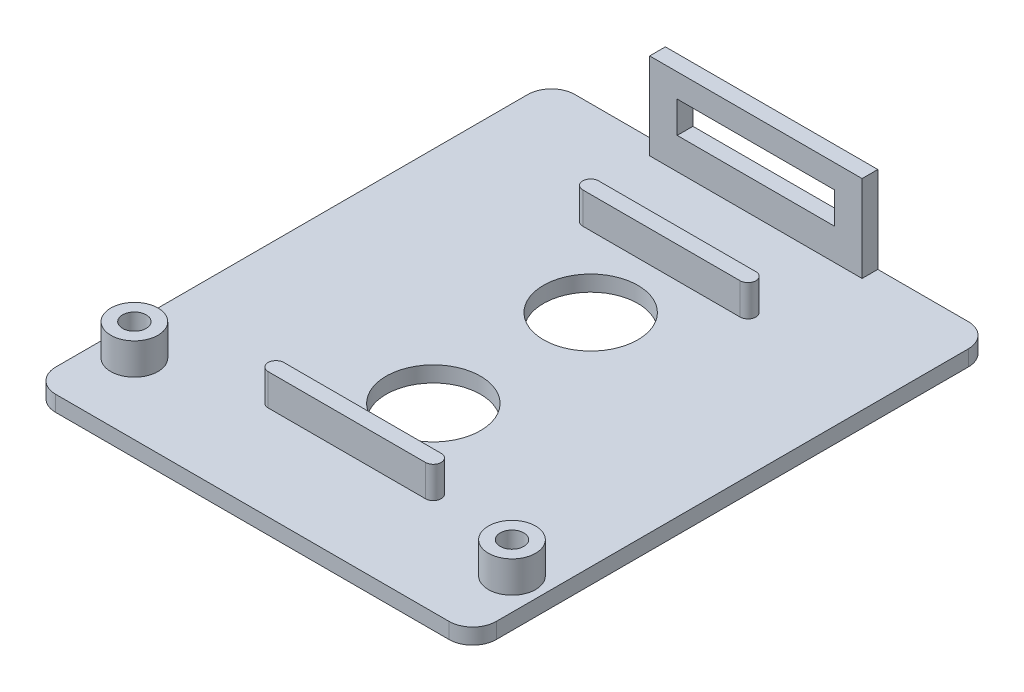
ISO-10303-21;
HEADER;
FILE_DESCRIPTION(('STEP AP214'),'2;1');
FILE_NAME('part.step','',(''),(''),'','','');
FILE_SCHEMA(('AUTOMOTIVE_DESIGN { 1 0 10303 214 1 1 1 1 }'));
ENDSEC;
DATA;
#1=APPLICATION_CONTEXT('core data for automotive mechanical design processes');
#2=APPLICATION_PROTOCOL_DEFINITION('international standard','automotive_design',2000,#1);
#3=PRODUCT_CONTEXT('',#1,'mechanical');
#4=PRODUCT('Part','Part','',(#3));
#5=PRODUCT_RELATED_PRODUCT_CATEGORY('part','',(#4));
#6=PRODUCT_DEFINITION_FORMATION('','',#4);
#7=PRODUCT_DEFINITION_CONTEXT('part definition',#1,'design');
#8=PRODUCT_DEFINITION('design','',#6,#7);
#9=PRODUCT_DEFINITION_SHAPE('','',#8);
#10=(LENGTH_UNIT() NAMED_UNIT(*) SI_UNIT(.MILLI.,.METRE.));
#11=(NAMED_UNIT(*) PLANE_ANGLE_UNIT() SI_UNIT($,.RADIAN.));
#12=(NAMED_UNIT(*) SI_UNIT($,.STERADIAN.) SOLID_ANGLE_UNIT());
#13=UNCERTAINTY_MEASURE_WITH_UNIT(LENGTH_MEASURE(1.E-05),#10,'distance_accuracy_value','');
#14=(GEOMETRIC_REPRESENTATION_CONTEXT(3) GLOBAL_UNCERTAINTY_ASSIGNED_CONTEXT((#13)) GLOBAL_UNIT_ASSIGNED_CONTEXT((#10,
#11,#12)) REPRESENTATION_CONTEXT('',''));
#15=CARTESIAN_POINT('',(0.,0.,0.));
#16=DIRECTION('',(0.,0.,1.));
#17=DIRECTION('',(1.,0.,0.));
#18=AXIS2_PLACEMENT_3D('',#15,#16,#17);
#19=CARTESIAN_POINT('',(0.,1.,0.));
#20=DIRECTION('',(0.,1.,0.));
#21=DIRECTION('',(0.,0.,1.));
#22=AXIS2_PLACEMENT_3D('',#19,#20,#21);
#23=PLANE('',#22);
#24=DIRECTION('',(-1.,0.,0.));
#25=VECTOR('',#24,1.);
#26=CARTESIAN_POINT('',(0.,1.,-9.5));
#27=LINE('',#26,#25);
#28=CARTESIAN_POINT('',(5.,1.,-9.5));
#29=VERTEX_POINT('',#28);
#30=CARTESIAN_POINT('',(-5.,1.,-9.5));
#31=VERTEX_POINT('',#30);
#32=EDGE_CURVE('E139',#29,#31,#27,.T.);
#33=ORIENTED_EDGE('',*,*,#32,.T.);
#34=CARTESIAN_POINT('',(-5.,1.,-10.));
#35=DIRECTION('',(0.,1.,0.));
#36=DIRECTION('',(0.,0.,1.));
#37=AXIS2_PLACEMENT_3D('',#34,#35,#36);
#38=CIRCLE('',#37,0.5);
#39=CARTESIAN_POINT('',(-5.,1.,-10.5));
#40=VERTEX_POINT('',#39);
#41=EDGE_CURVE('E12',#31,#40,#38,.F.);
#42=ORIENTED_EDGE('',*,*,#41,.T.);
#43=DIRECTION('',(-1.,0.,0.));
#44=VECTOR('',#43,1.);
#45=CARTESIAN_POINT('',(0.,1.,-10.5));
#46=LINE('',#45,#44);
#47=CARTESIAN_POINT('',(5.,1.,-10.5));
#48=VERTEX_POINT('',#47);
#49=EDGE_CURVE('E509',#48,#40,#46,.T.);
#50=ORIENTED_EDGE('',*,*,#49,.F.);
#51=CARTESIAN_POINT('',(5.,1.,-10.));
#52=DIRECTION('',(0.,1.,0.));
#53=DIRECTION('',(0.,0.,1.));
#54=AXIS2_PLACEMENT_3D('',#51,#52,#53);
#55=CIRCLE('',#54,0.5);
#56=EDGE_CURVE('E514',#48,#29,#55,.F.);
#57=ORIENTED_EDGE('',*,*,#56,.T.);
#58=EDGE_LOOP('',(#33,#42,#50,#57));
#59=FACE_BOUND('',#58,.T.);
#60=CARTESIAN_POINT('',(0.,1.,5.));
#61=DIRECTION('',(0.,1.,0.));
#62=DIRECTION('',(0.,0.,1.));
#63=AXIS2_PLACEMENT_3D('',#60,#61,#62);
#64=CIRCLE('',#63,3.);
#65=CARTESIAN_POINT('',(0.,1.,8.));
#66=VERTEX_POINT('',#65);
#67=EDGE_CURVE('E412',#66,#66,#64,.T.);
#68=ORIENTED_EDGE('',*,*,#67,.F.);
#69=EDGE_LOOP('',(#68));
#70=FACE_BOUND('',#69,.T.);
#71=CARTESIAN_POINT('',(0.,1.,-5.));
#72=DIRECTION('',(0.,1.,0.));
#73=DIRECTION('',(0.,0.,1.));
#74=AXIS2_PLACEMENT_3D('',#71,#72,#73);
#75=CIRCLE('',#74,3.);
#76=CARTESIAN_POINT('',(0.,1.,-2.));
#77=VERTEX_POINT('',#76);
#78=EDGE_CURVE('E415',#77,#77,#75,.T.);
#79=ORIENTED_EDGE('',*,*,#78,.F.);
#80=EDGE_LOOP('',(#79));
#81=FACE_BOUND('',#80,.T.);
#82=CARTESIAN_POINT('',(12.,1.,12.));
#83=DIRECTION('',(0.,1.,0.));
#84=DIRECTION('',(0.,0.,1.));
#85=AXIS2_PLACEMENT_3D('',#82,#83,#84);
#86=CIRCLE('',#85,1.5);
#87=CARTESIAN_POINT('',(12.,1.,13.5));
#88=VERTEX_POINT('',#87);
#89=EDGE_CURVE('E419',#88,#88,#86,.T.);
#90=ORIENTED_EDGE('',*,*,#89,.F.);
#91=EDGE_LOOP('',(#90));
#92=FACE_BOUND('',#91,.T.);
#93=CARTESIAN_POINT('',(-12.,1.,12.));
#94=DIRECTION('',(0.,1.,0.));
#95=DIRECTION('',(0.,0.,1.));
#96=AXIS2_PLACEMENT_3D('',#93,#94,#95);
#97=CIRCLE('',#96,1.5);
#98=CARTESIAN_POINT('',(-12.,1.,13.5));
#99=VERTEX_POINT('',#98);
#100=EDGE_CURVE('E422',#99,#99,#97,.T.);
#101=ORIENTED_EDGE('',*,*,#100,.F.);
#102=EDGE_LOOP('',(#101));
#103=FACE_BOUND('',#102,.T.);
#104=CARTESIAN_POINT('',(12.5,1.,15.));
#105=DIRECTION('',(0.,1.,0.));
#106=DIRECTION('',(0.,0.,1.));
#107=AXIS2_PLACEMENT_3D('',#104,#105,#106);
#108=CIRCLE('',#107,1.5);
#109=CARTESIAN_POINT('',(14.,1.,15.));
#110=VERTEX_POINT('',#109);
#111=CARTESIAN_POINT('',(12.5,1.,16.5));
#112=VERTEX_POINT('',#111);
#113=EDGE_CURVE('E425',#110,#112,#108,.F.);
#114=ORIENTED_EDGE('',*,*,#113,.F.);
#115=DIRECTION('',(0.,0.,1.));
#116=VECTOR('',#115,1.);
#117=CARTESIAN_POINT('',(14.,1.,0.));
#118=LINE('',#117,#116);
#119=CARTESIAN_POINT('',(14.,1.,-15.));
#120=VERTEX_POINT('',#119);
#121=EDGE_CURVE('E428',#120,#110,#118,.T.);
#122=ORIENTED_EDGE('',*,*,#121,.F.);
#123=CARTESIAN_POINT('',(12.5,1.,-15.));
#124=DIRECTION('',(0.,1.,0.));
#125=DIRECTION('',(0.,0.,1.));
#126=AXIS2_PLACEMENT_3D('',#123,#124,#125);
#127=CIRCLE('',#126,1.5);
#128=CARTESIAN_POINT('',(12.5,1.,-16.5));
#129=VERTEX_POINT('',#128);
#130=EDGE_CURVE('E431',#120,#129,#127,.T.);
#131=ORIENTED_EDGE('',*,*,#130,.T.);
#132=DIRECTION('',(-1.,0.,0.));
#133=VECTOR('',#132,1.);
#134=CARTESIAN_POINT('',(0.,1.,-16.5));
#135=LINE('',#134,#133);
#136=CARTESIAN_POINT('',(6.75,1.,-16.5));
#137=VERTEX_POINT('',#136);
#138=EDGE_CURVE('E434',#129,#137,#135,.T.);
#139=ORIENTED_EDGE('',*,*,#138,.T.);
#140=DIRECTION('',(0.,0.,1.));
#141=VECTOR('',#140,1.);
#142=CARTESIAN_POINT('',(6.75000000000001,1.,0.));
#143=LINE('',#142,#141);
#144=CARTESIAN_POINT('',(6.75,1.,-15.5));
#145=VERTEX_POINT('',#144);
#146=EDGE_CURVE('E436',#137,#145,#143,.T.);
#147=ORIENTED_EDGE('',*,*,#146,.T.);
#148=DIRECTION('',(1.,0.,0.));
#149=VECTOR('',#148,1.);
#150=CARTESIAN_POINT('',(0.,1.,-15.5));
#151=LINE('',#150,#149);
#152=CARTESIAN_POINT('',(-6.75,1.,-15.5));
#153=VERTEX_POINT('',#152);
#154=EDGE_CURVE('E439',#153,#145,#151,.T.);
#155=ORIENTED_EDGE('',*,*,#154,.F.);
#156=DIRECTION('',(0.,0.,1.));
#157=VECTOR('',#156,1.);
#158=CARTESIAN_POINT('',(-6.75,1.,0.));
#159=LINE('',#158,#157);
#160=CARTESIAN_POINT('',(-6.75,1.,-16.5));
#161=VERTEX_POINT('',#160);
#162=EDGE_CURVE('E442',#161,#153,#159,.T.);
#163=ORIENTED_EDGE('',*,*,#162,.F.);
#164=CARTESIAN_POINT('',(-12.5,1.,-16.5));
#165=VERTEX_POINT('',#164);
#166=EDGE_CURVE('E437',#161,#165,#135,.T.);
#167=ORIENTED_EDGE('',*,*,#166,.T.);
#168=CARTESIAN_POINT('',(-12.5,1.,-15.));
#169=DIRECTION('',(0.,1.,0.));
#170=DIRECTION('',(0.,0.,1.));
#171=AXIS2_PLACEMENT_3D('',#168,#169,#170);
#172=CIRCLE('',#171,1.5);
#173=CARTESIAN_POINT('',(-14.,1.,-15.));
#174=VERTEX_POINT('',#173);
#175=EDGE_CURVE('E445',#165,#174,#172,.T.);
#176=ORIENTED_EDGE('',*,*,#175,.T.);
#177=DIRECTION('',(0.,0.,1.));
#178=VECTOR('',#177,1.);
#179=CARTESIAN_POINT('',(-14.,1.,0.));
#180=LINE('',#179,#178);
#181=CARTESIAN_POINT('',(-14.,1.,15.));
#182=VERTEX_POINT('',#181);
#183=EDGE_CURVE('E448',#174,#182,#180,.T.);
#184=ORIENTED_EDGE('',*,*,#183,.T.);
#185=CARTESIAN_POINT('',(-12.5,1.,15.));
#186=DIRECTION('',(0.,1.,0.));
#187=DIRECTION('',(0.,0.,1.));
#188=AXIS2_PLACEMENT_3D('',#185,#186,#187);
#189=CIRCLE('',#188,1.5);
#190=CARTESIAN_POINT('',(-12.5,1.,16.5));
#191=VERTEX_POINT('',#190);
#192=EDGE_CURVE('E450',#191,#182,#189,.F.);
#193=ORIENTED_EDGE('',*,*,#192,.F.);
#194=DIRECTION('',(-1.,0.,0.));
#195=VECTOR('',#194,1.);
#196=CARTESIAN_POINT('',(0.,1.,16.5));
#197=LINE('',#196,#195);
#198=EDGE_CURVE('E453',#112,#191,#197,.T.);
#199=ORIENTED_EDGE('',*,*,#198,.F.);
#200=EDGE_LOOP('',(#114,#122,#131,#139,#147,#155,#163,#167,#176,#184,#193,#199));
#201=FACE_BOUND('',#200,.T.);
#202=DIRECTION('',(-1.,0.,0.));
#203=VECTOR('',#202,1.);
#204=CARTESIAN_POINT('',(0.,1.,10.5));
#205=LINE('',#204,#203);
#206=CARTESIAN_POINT('',(5.,1.,10.5));
#207=VERTEX_POINT('',#206);
#208=CARTESIAN_POINT('',(-5.,1.,10.5));
#209=VERTEX_POINT('',#208);
#210=EDGE_CURVE('E355',#207,#209,#205,.T.);
#211=ORIENTED_EDGE('',*,*,#210,.T.);
#212=CARTESIAN_POINT('',(-5.,1.,10.));
#213=DIRECTION('',(0.,1.,0.));
#214=DIRECTION('',(0.,0.,1.));
#215=AXIS2_PLACEMENT_3D('',#212,#213,#214);
#216=CIRCLE('',#215,0.5);
#217=CARTESIAN_POINT('',(-5.,1.,9.5));
#218=VERTEX_POINT('',#217);
#219=EDGE_CURVE('E357',#209,#218,#216,.F.);
#220=ORIENTED_EDGE('',*,*,#219,.T.);
#221=DIRECTION('',(-1.,0.,0.));
#222=VECTOR('',#221,1.);
#223=CARTESIAN_POINT('',(0.,1.,9.5));
#224=LINE('',#223,#222);
#225=CARTESIAN_POINT('',(5.,1.,9.5));
#226=VERTEX_POINT('',#225);
#227=EDGE_CURVE('E350',#226,#218,#224,.T.);
#228=ORIENTED_EDGE('',*,*,#227,.F.);
#229=CARTESIAN_POINT('',(5.,1.,10.));
#230=DIRECTION('',(0.,1.,0.));
#231=DIRECTION('',(0.,0.,1.));
#232=AXIS2_PLACEMENT_3D('',#229,#230,#231);
#233=CIRCLE('',#232,0.5);
#234=EDGE_CURVE('E353',#226,#207,#233,.F.);
#235=ORIENTED_EDGE('',*,*,#234,.T.);
#236=EDGE_LOOP('',(#211,#220,#228,#235));
#237=FACE_BOUND('',#236,.T.);
#238=ADVANCED_FACE('F131',(#59,#70,#81,#92,#103,#201,#237),#23,.T.);
#239=CARTESIAN_POINT('',(12.,3.,12.));
#240=DIRECTION('',(0.,-1.,0.));
#241=DIRECTION('',(0.,0.,-1.));
#242=AXIS2_PLACEMENT_3D('',#239,#240,#241);
#243=CYLINDRICAL_SURFACE('',#242,0.75);
#244=CARTESIAN_POINT('',(12.,3.,12.));
#245=DIRECTION('',(0.,1.,0.));
#246=DIRECTION('',(0.,0.,1.));
#247=AXIS2_PLACEMENT_3D('',#244,#245,#246);
#248=CIRCLE('',#247,0.75);
#249=CARTESIAN_POINT('',(12.,3.,12.75));
#250=VERTEX_POINT('',#249);
#251=EDGE_CURVE('E503',#250,#250,#248,.T.);
#252=ORIENTED_EDGE('',*,*,#251,.T.);
#253=EDGE_LOOP('',(#252));
#254=FACE_BOUND('',#253,.T.);
#255=CARTESIAN_POINT('',(12.,0.,12.));
#256=DIRECTION('',(0.,1.,0.));
#257=DIRECTION('',(0.,0.,1.));
#258=AXIS2_PLACEMENT_3D('',#255,#256,#257);
#259=CIRCLE('',#258,0.75);
#260=CARTESIAN_POINT('',(12.,0.,12.75));
#261=VERTEX_POINT('',#260);
#262=EDGE_CURVE('E502',#261,#261,#259,.T.);
#263=ORIENTED_EDGE('',*,*,#262,.F.);
#264=EDGE_LOOP('',(#263));
#265=FACE_BOUND('',#264,.T.);
#266=ADVANCED_FACE('F133',(#254,#265),#243,.F.);
#267=CARTESIAN_POINT('',(12.,3.,12.));
#268=DIRECTION('',(0.,-1.,0.));
#269=DIRECTION('',(0.,0.,-1.));
#270=AXIS2_PLACEMENT_3D('',#267,#268,#269);
#271=CYLINDRICAL_SURFACE('',#270,1.5);
#272=ORIENTED_EDGE('',*,*,#89,.T.);
#273=EDGE_LOOP('',(#272));
#274=FACE_BOUND('',#273,.T.);
#275=CARTESIAN_POINT('',(12.,3.,12.));
#276=DIRECTION('',(0.,1.,0.));
#277=DIRECTION('',(0.,0.,1.));
#278=AXIS2_PLACEMENT_3D('',#275,#276,#277);
#279=CIRCLE('',#278,1.5);
#280=CARTESIAN_POINT('',(12.,3.,13.5));
#281=VERTEX_POINT('',#280);
#282=EDGE_CURVE('E506',#281,#281,#279,.T.);
#283=ORIENTED_EDGE('',*,*,#282,.F.);
#284=EDGE_LOOP('',(#283));
#285=FACE_BOUND('',#284,.T.);
#286=ADVANCED_FACE('F549',(#274,#285),#271,.T.);
#287=CARTESIAN_POINT('',(0.,3.,0.));
#288=DIRECTION('',(0.,1.,0.));
#289=DIRECTION('',(0.,0.,1.));
#290=AXIS2_PLACEMENT_3D('',#287,#288,#289);
#291=PLANE('',#290);
#292=ORIENTED_EDGE('',*,*,#251,.F.);
#293=EDGE_LOOP('',(#292));
#294=FACE_BOUND('',#293,.T.);
#295=ORIENTED_EDGE('',*,*,#282,.T.);
#296=EDGE_LOOP('',(#295));
#297=FACE_BOUND('',#296,.T.);
#298=ADVANCED_FACE('F596',(#294,#297),#291,.T.);
#299=CARTESIAN_POINT('',(0.,0.,0.));
#300=DIRECTION('',(0.,1.,0.));
#301=DIRECTION('',(0.,0.,1.));
#302=AXIS2_PLACEMENT_3D('',#299,#300,#301);
#303=PLANE('',#302);
#304=CARTESIAN_POINT('',(-12.5,0.,-15.));
#305=DIRECTION('',(0.,1.,0.));
#306=DIRECTION('',(0.,0.,1.));
#307=AXIS2_PLACEMENT_3D('',#304,#305,#306);
#308=CIRCLE('',#307,1.5);
#309=CARTESIAN_POINT('',(-12.5,0.,-16.5));
#310=VERTEX_POINT('',#309);
#311=CARTESIAN_POINT('',(-14.,0.,-15.));
#312=VERTEX_POINT('',#311);
#313=EDGE_CURVE('E473',#310,#312,#308,.T.);
#314=ORIENTED_EDGE('',*,*,#313,.F.);
#315=DIRECTION('',(-1.,0.,0.));
#316=VECTOR('',#315,1.);
#317=CARTESIAN_POINT('',(0.,0.,-16.5));
#318=LINE('',#317,#316);
#319=CARTESIAN_POINT('',(12.5,0.,-16.5));
#320=VERTEX_POINT('',#319);
#321=EDGE_CURVE('E471',#320,#310,#318,.T.);
#322=ORIENTED_EDGE('',*,*,#321,.F.);
#323=CARTESIAN_POINT('',(12.5,0.,-15.));
#324=DIRECTION('',(0.,1.,0.));
#325=DIRECTION('',(0.,0.,1.));
#326=AXIS2_PLACEMENT_3D('',#323,#324,#325);
#327=CIRCLE('',#326,1.5);
#328=CARTESIAN_POINT('',(14.,0.,-15.));
#329=VERTEX_POINT('',#328);
#330=EDGE_CURVE('E468',#329,#320,#327,.T.);
#331=ORIENTED_EDGE('',*,*,#330,.F.);
#332=DIRECTION('',(0.,0.,1.));
#333=VECTOR('',#332,1.);
#334=CARTESIAN_POINT('',(14.,0.,0.));
#335=LINE('',#334,#333);
#336=CARTESIAN_POINT('',(14.,0.,15.));
#337=VERTEX_POINT('',#336);
#338=EDGE_CURVE('E465',#329,#337,#335,.T.);
#339=ORIENTED_EDGE('',*,*,#338,.T.);
#340=CARTESIAN_POINT('',(12.5,0.,15.));
#341=DIRECTION('',(0.,1.,0.));
#342=DIRECTION('',(0.,0.,1.));
#343=AXIS2_PLACEMENT_3D('',#340,#341,#342);
#344=CIRCLE('',#343,1.5);
#345=CARTESIAN_POINT('',(12.5,0.,16.5));
#346=VERTEX_POINT('',#345);
#347=EDGE_CURVE('E462',#337,#346,#344,.F.);
#348=ORIENTED_EDGE('',*,*,#347,.T.);
#349=DIRECTION('',(-1.,0.,0.));
#350=VECTOR('',#349,1.);
#351=CARTESIAN_POINT('',(0.,0.,16.5));
#352=LINE('',#351,#350);
#353=CARTESIAN_POINT('',(-12.5,0.,16.5));
#354=VERTEX_POINT('',#353);
#355=EDGE_CURVE('E416',#346,#354,#352,.T.);
#356=ORIENTED_EDGE('',*,*,#355,.T.);
#357=CARTESIAN_POINT('',(-12.5,0.,15.));
#358=DIRECTION('',(0.,1.,0.));
#359=DIRECTION('',(0.,0.,1.));
#360=AXIS2_PLACEMENT_3D('',#357,#358,#359);
#361=CIRCLE('',#360,1.5);
#362=CARTESIAN_POINT('',(-14.,0.,15.));
#363=VERTEX_POINT('',#362);
#364=EDGE_CURVE('E479',#354,#363,#361,.F.);
#365=ORIENTED_EDGE('',*,*,#364,.T.);
#366=DIRECTION('',(0.,0.,1.));
#367=VECTOR('',#366,1.);
#368=CARTESIAN_POINT('',(-14.,0.,0.));
#369=LINE('',#368,#367);
#370=EDGE_CURVE('E476',#312,#363,#369,.T.);
#371=ORIENTED_EDGE('',*,*,#370,.F.);
#372=EDGE_LOOP('',(#314,#322,#331,#339,#348,#356,#365,#371));
#373=FACE_BOUND('',#372,.T.);
#374=ORIENTED_EDGE('',*,*,#262,.T.);
#375=EDGE_LOOP('',(#374));
#376=FACE_BOUND('',#375,.T.);
#377=CARTESIAN_POINT('',(0.,0.,5.));
#378=DIRECTION('',(0.,1.,0.));
#379=DIRECTION('',(0.,0.,1.));
#380=AXIS2_PLACEMENT_3D('',#377,#378,#379);
#381=CIRCLE('',#380,3.);
#382=CARTESIAN_POINT('',(0.,0.,8.));
#383=VERTEX_POINT('',#382);
#384=EDGE_CURVE('E411',#383,#383,#381,.T.);
#385=ORIENTED_EDGE('',*,*,#384,.T.);
#386=EDGE_LOOP('',(#385));
#387=FACE_BOUND('',#386,.T.);
#388=CARTESIAN_POINT('',(0.,0.,-5.));
#389=DIRECTION('',(0.,1.,0.));
#390=DIRECTION('',(0.,0.,1.));
#391=AXIS2_PLACEMENT_3D('',#388,#389,#390);
#392=CIRCLE('',#391,3.);
#393=CARTESIAN_POINT('',(0.,0.,-2.));
#394=VERTEX_POINT('',#393);
#395=EDGE_CURVE('E459',#394,#394,#392,.T.);
#396=ORIENTED_EDGE('',*,*,#395,.T.);
#397=EDGE_LOOP('',(#396));
#398=FACE_BOUND('',#397,.T.);
#399=CARTESIAN_POINT('',(-12.,0.,12.));
#400=DIRECTION('',(0.,1.,0.));
#401=DIRECTION('',(0.,0.,1.));
#402=AXIS2_PLACEMENT_3D('',#399,#400,#401);
#403=CIRCLE('',#402,0.75);
#404=CARTESIAN_POINT('',(-12.,0.,12.75));
#405=VERTEX_POINT('',#404);
#406=EDGE_CURVE('E381',#405,#405,#403,.T.);
#407=ORIENTED_EDGE('',*,*,#406,.T.);
#408=EDGE_LOOP('',(#407));
#409=FACE_BOUND('',#408,.T.);
#410=ADVANCED_FACE('F583',(#373,#376,#387,#398,#409),#303,.F.);
#411=CARTESIAN_POINT('',(14.,1.,0.));
#412=DIRECTION('',(1.,0.,0.));
#413=DIRECTION('',(0.,0.,-1.));
#414=AXIS2_PLACEMENT_3D('',#411,#412,#413);
#415=PLANE('',#414);
#416=ORIENTED_EDGE('',*,*,#338,.F.);
#417=DIRECTION('',(0.,-1.,0.));
#418=VECTOR('',#417,1.);
#419=CARTESIAN_POINT('',(14.,1.,-15.));
#420=LINE('',#419,#418);
#421=EDGE_CURVE('E498',#120,#329,#420,.T.);
#422=ORIENTED_EDGE('',*,*,#421,.F.);
#423=ORIENTED_EDGE('',*,*,#121,.T.);
#424=DIRECTION('',(0.,-1.,0.));
#425=VECTOR('',#424,1.);
#426=CARTESIAN_POINT('',(14.,1.,15.));
#427=LINE('',#426,#425);
#428=EDGE_CURVE('E500',#110,#337,#427,.T.);
#429=ORIENTED_EDGE('',*,*,#428,.T.);
#430=EDGE_LOOP('',(#416,#422,#423,#429));
#431=FACE_BOUND('',#430,.T.);
#432=ADVANCED_FACE('F579',(#431),#415,.T.);
#433=CARTESIAN_POINT('',(12.5,1.,-15.));
#434=DIRECTION('',(0.,-1.,0.));
#435=DIRECTION('',(0.,0.,-1.));
#436=AXIS2_PLACEMENT_3D('',#433,#434,#435);
#437=CYLINDRICAL_SURFACE('',#436,1.5);
#438=ORIENTED_EDGE('',*,*,#330,.T.);
#439=DIRECTION('',(0.,-1.,0.));
#440=VECTOR('',#439,1.);
#441=CARTESIAN_POINT('',(12.5,1.,-16.5));
#442=LINE('',#441,#440);
#443=EDGE_CURVE('E495',#129,#320,#442,.T.);
#444=ORIENTED_EDGE('',*,*,#443,.F.);
#445=ORIENTED_EDGE('',*,*,#130,.F.);
#446=ORIENTED_EDGE('',*,*,#421,.T.);
#447=EDGE_LOOP('',(#438,#444,#445,#446));
#448=FACE_BOUND('',#447,.T.);
#449=ADVANCED_FACE('F575',(#448),#437,.T.);
#450=CARTESIAN_POINT('',(0.,1.,-16.5));
#451=DIRECTION('',(0.,0.,1.));
#452=DIRECTION('',(1.,0.,0.));
#453=AXIS2_PLACEMENT_3D('',#450,#451,#452);
#454=PLANE('',#453);
#455=DIRECTION('',(-1.,0.,0.));
#456=VECTOR('',#455,1.);
#457=CARTESIAN_POINT('',(0.,5.,-16.5));
#458=LINE('',#457,#456);
#459=CARTESIAN_POINT('',(5.,5.,-16.5));
#460=VERTEX_POINT('',#459);
#461=CARTESIAN_POINT('',(-5.,5.,-16.5));
#462=VERTEX_POINT('',#461);
#463=EDGE_CURVE('E322',#460,#462,#458,.T.);
#464=ORIENTED_EDGE('',*,*,#463,.T.);
#465=DIRECTION('',(0.,-1.,0.));
#466=VECTOR('',#465,1.);
#467=CARTESIAN_POINT('',(-5.,1.,-16.5));
#468=LINE('',#467,#466);
#469=CARTESIAN_POINT('',(-5.,3.,-16.5));
#470=VERTEX_POINT('',#469);
#471=EDGE_CURVE('E325',#462,#470,#468,.T.);
#472=ORIENTED_EDGE('',*,*,#471,.T.);
#473=DIRECTION('',(1.,0.,0.));
#474=VECTOR('',#473,1.);
#475=CARTESIAN_POINT('',(0.,3.,-16.5));
#476=LINE('',#475,#474);
#477=CARTESIAN_POINT('',(5.,3.,-16.5));
#478=VERTEX_POINT('',#477);
#479=EDGE_CURVE('E317',#470,#478,#476,.T.);
#480=ORIENTED_EDGE('',*,*,#479,.T.);
#481=DIRECTION('',(0.,1.,0.));
#482=VECTOR('',#481,1.);
#483=CARTESIAN_POINT('',(5.,1.,-16.5));
#484=LINE('',#483,#482);
#485=EDGE_CURVE('E297',#478,#460,#484,.T.);
#486=ORIENTED_EDGE('',*,*,#485,.T.);
#487=EDGE_LOOP('',(#464,#472,#480,#486));
#488=FACE_BOUND('',#487,.T.);
#489=ORIENTED_EDGE('',*,*,#321,.T.);
#490=DIRECTION('',(0.,-1.,0.));
#491=VECTOR('',#490,1.);
#492=CARTESIAN_POINT('',(-12.5,1.,-16.5));
#493=LINE('',#492,#491);
#494=EDGE_CURVE('E492',#165,#310,#493,.T.);
#495=ORIENTED_EDGE('',*,*,#494,.F.);
#496=ORIENTED_EDGE('',*,*,#166,.F.);
#497=DIRECTION('',(0.,-1.,0.));
#498=VECTOR('',#497,1.);
#499=CARTESIAN_POINT('',(-6.75,6.5,-16.5));
#500=LINE('',#499,#498);
#501=CARTESIAN_POINT('',(-6.75,6.5,-16.5));
#502=VERTEX_POINT('',#501);
#503=EDGE_CURVE('E405',#502,#161,#500,.T.);
#504=ORIENTED_EDGE('',*,*,#503,.F.);
#505=DIRECTION('',(-1.,0.,0.));
#506=VECTOR('',#505,1.);
#507=CARTESIAN_POINT('',(0.,6.5,-16.5));
#508=LINE('',#507,#506);
#509=CARTESIAN_POINT('',(6.75,6.5,-16.5));
#510=VERTEX_POINT('',#509);
#511=EDGE_CURVE('E393',#510,#502,#508,.T.);
#512=ORIENTED_EDGE('',*,*,#511,.F.);
#513=DIRECTION('',(0.,-1.,0.));
#514=VECTOR('',#513,1.);
#515=CARTESIAN_POINT('',(6.75,6.5,-16.5));
#516=LINE('',#515,#514);
#517=EDGE_CURVE('E408',#510,#137,#516,.T.);
#518=ORIENTED_EDGE('',*,*,#517,.T.);
#519=ORIENTED_EDGE('',*,*,#138,.F.);
#520=ORIENTED_EDGE('',*,*,#443,.T.);
#521=EDGE_LOOP('',(#489,#495,#496,#504,#512,#518,#519,#520));
#522=FACE_BOUND('',#521,.T.);
#523=ADVANCED_FACE('F571',(#488,#522),#454,.F.);
#524=CARTESIAN_POINT('',(-12.5,1.,-15.));
#525=DIRECTION('',(0.,-1.,0.));
#526=DIRECTION('',(0.,0.,-1.));
#527=AXIS2_PLACEMENT_3D('',#524,#525,#526);
#528=CYLINDRICAL_SURFACE('',#527,1.5);
#529=ORIENTED_EDGE('',*,*,#313,.T.);
#530=DIRECTION('',(0.,-1.,0.));
#531=VECTOR('',#530,1.);
#532=CARTESIAN_POINT('',(-14.,1.,-15.));
#533=LINE('',#532,#531);
#534=EDGE_CURVE('E489',#174,#312,#533,.T.);
#535=ORIENTED_EDGE('',*,*,#534,.F.);
#536=ORIENTED_EDGE('',*,*,#175,.F.);
#537=ORIENTED_EDGE('',*,*,#494,.T.);
#538=EDGE_LOOP('',(#529,#535,#536,#537));
#539=FACE_BOUND('',#538,.T.);
#540=ADVANCED_FACE('F567',(#539),#528,.T.);
#541=CARTESIAN_POINT('',(-14.,1.,0.));
#542=DIRECTION('',(1.,0.,0.));
#543=DIRECTION('',(0.,0.,-1.));
#544=AXIS2_PLACEMENT_3D('',#541,#542,#543);
#545=PLANE('',#544);
#546=ORIENTED_EDGE('',*,*,#370,.T.);
#547=DIRECTION('',(0.,-1.,0.));
#548=VECTOR('',#547,1.);
#549=CARTESIAN_POINT('',(-14.,1.,15.));
#550=LINE('',#549,#548);
#551=EDGE_CURVE('E487',#182,#363,#550,.T.);
#552=ORIENTED_EDGE('',*,*,#551,.F.);
#553=ORIENTED_EDGE('',*,*,#183,.F.);
#554=ORIENTED_EDGE('',*,*,#534,.T.);
#555=EDGE_LOOP('',(#546,#552,#553,#554));
#556=FACE_BOUND('',#555,.T.);
#557=ADVANCED_FACE('F563',(#556),#545,.F.);
#558=CARTESIAN_POINT('',(-12.5,1.,15.));
#559=DIRECTION('',(0.,-1.,0.));
#560=DIRECTION('',(0.,0.,-1.));
#561=AXIS2_PLACEMENT_3D('',#558,#559,#560);
#562=CYLINDRICAL_SURFACE('',#561,1.5);
#563=ORIENTED_EDGE('',*,*,#364,.F.);
#564=DIRECTION('',(0.,-1.,0.));
#565=VECTOR('',#564,1.);
#566=CARTESIAN_POINT('',(-12.5,1.,16.5));
#567=LINE('',#566,#565);
#568=EDGE_CURVE('E485',#191,#354,#567,.T.);
#569=ORIENTED_EDGE('',*,*,#568,.F.);
#570=ORIENTED_EDGE('',*,*,#192,.T.);
#571=ORIENTED_EDGE('',*,*,#551,.T.);
#572=EDGE_LOOP('',(#563,#569,#570,#571));
#573=FACE_BOUND('',#572,.T.);
#574=ADVANCED_FACE('F559',(#573),#562,.T.);
#575=CARTESIAN_POINT('',(0.,1.,16.5));
#576=DIRECTION('',(0.,0.,1.));
#577=DIRECTION('',(1.,0.,0.));
#578=AXIS2_PLACEMENT_3D('',#575,#576,#577);
#579=PLANE('',#578);
#580=ORIENTED_EDGE('',*,*,#355,.F.);
#581=DIRECTION('',(0.,-1.,0.));
#582=VECTOR('',#581,1.);
#583=CARTESIAN_POINT('',(12.5,1.,16.5));
#584=LINE('',#583,#582);
#585=EDGE_CURVE('E456',#112,#346,#584,.T.);
#586=ORIENTED_EDGE('',*,*,#585,.F.);
#587=ORIENTED_EDGE('',*,*,#198,.T.);
#588=ORIENTED_EDGE('',*,*,#568,.T.);
#589=EDGE_LOOP('',(#580,#586,#587,#588));
#590=FACE_BOUND('',#589,.T.);
#591=ADVANCED_FACE('F555',(#590),#579,.T.);
#592=CARTESIAN_POINT('',(12.5,1.,15.));
#593=DIRECTION('',(0.,-1.,0.));
#594=DIRECTION('',(0.,0.,-1.));
#595=AXIS2_PLACEMENT_3D('',#592,#593,#594);
#596=CYLINDRICAL_SURFACE('',#595,1.5);
#597=ORIENTED_EDGE('',*,*,#347,.F.);
#598=ORIENTED_EDGE('',*,*,#428,.F.);
#599=ORIENTED_EDGE('',*,*,#113,.T.);
#600=ORIENTED_EDGE('',*,*,#585,.T.);
#601=EDGE_LOOP('',(#597,#598,#599,#600));
#602=FACE_BOUND('',#601,.T.);
#603=ADVANCED_FACE('F558',(#602),#596,.T.);
#604=CARTESIAN_POINT('',(0.,1.,-5.));
#605=DIRECTION('',(0.,-1.,0.));
#606=DIRECTION('',(0.,0.,-1.));
#607=AXIS2_PLACEMENT_3D('',#604,#605,#606);
#608=CYLINDRICAL_SURFACE('',#607,3.);
#609=ORIENTED_EDGE('',*,*,#78,.T.);
#610=EDGE_LOOP('',(#609));
#611=FACE_BOUND('',#610,.T.);
#612=ORIENTED_EDGE('',*,*,#395,.F.);
#613=EDGE_LOOP('',(#612));
#614=FACE_BOUND('',#613,.T.);
#615=ADVANCED_FACE('F587',(#611,#614),#608,.F.);
#616=CARTESIAN_POINT('',(0.,1.,5.));
#617=DIRECTION('',(0.,-1.,0.));
#618=DIRECTION('',(0.,0.,-1.));
#619=AXIS2_PLACEMENT_3D('',#616,#617,#618);
#620=CYLINDRICAL_SURFACE('',#619,3.);
#621=ORIENTED_EDGE('',*,*,#67,.T.);
#622=EDGE_LOOP('',(#621));
#623=FACE_BOUND('',#622,.T.);
#624=ORIENTED_EDGE('',*,*,#384,.F.);
#625=EDGE_LOOP('',(#624));
#626=FACE_BOUND('',#625,.T.);
#627=ADVANCED_FACE('F591',(#623,#626),#620,.F.);
#628=CARTESIAN_POINT('',(6.75000000000001,6.5,0.));
#629=DIRECTION('',(1.,0.,0.));
#630=DIRECTION('',(0.,0.,-1.));
#631=AXIS2_PLACEMENT_3D('',#628,#629,#630);
#632=PLANE('',#631);
#633=DIRECTION('',(0.,-1.,0.));
#634=VECTOR('',#633,1.);
#635=CARTESIAN_POINT('',(6.75,6.5,-15.5));
#636=LINE('',#635,#634);
#637=CARTESIAN_POINT('',(6.75,6.5,-15.5));
#638=VERTEX_POINT('',#637);
#639=EDGE_CURVE('E399',#638,#145,#636,.T.);
#640=ORIENTED_EDGE('',*,*,#639,.T.);
#641=ORIENTED_EDGE('',*,*,#146,.F.);
#642=ORIENTED_EDGE('',*,*,#517,.F.);
#643=DIRECTION('',(0.,0.,1.));
#644=VECTOR('',#643,1.);
#645=CARTESIAN_POINT('',(6.75000000000001,6.5,0.));
#646=LINE('',#645,#644);
#647=EDGE_CURVE('E388',#510,#638,#646,.T.);
#648=ORIENTED_EDGE('',*,*,#647,.T.);
#649=EDGE_LOOP('',(#640,#641,#642,#648));
#650=FACE_BOUND('',#649,.T.);
#651=ADVANCED_FACE('F553',(#650),#632,.T.);
#652=CARTESIAN_POINT('',(-6.75,6.5,0.));
#653=DIRECTION('',(1.,0.,0.));
#654=DIRECTION('',(0.,0.,-1.));
#655=AXIS2_PLACEMENT_3D('',#652,#653,#654);
#656=PLANE('',#655);
#657=ORIENTED_EDGE('',*,*,#162,.T.);
#658=DIRECTION('',(0.,-1.,0.));
#659=VECTOR('',#658,1.);
#660=CARTESIAN_POINT('',(-6.75,6.5,-15.5));
#661=LINE('',#660,#659);
#662=CARTESIAN_POINT('',(-6.75,6.5,-15.5));
#663=VERTEX_POINT('',#662);
#664=EDGE_CURVE('E402',#663,#153,#661,.T.);
#665=ORIENTED_EDGE('',*,*,#664,.F.);
#666=DIRECTION('',(0.,0.,1.));
#667=VECTOR('',#666,1.);
#668=CARTESIAN_POINT('',(-6.75,6.5,0.));
#669=LINE('',#668,#667);
#670=EDGE_CURVE('E395',#502,#663,#669,.T.);
#671=ORIENTED_EDGE('',*,*,#670,.F.);
#672=ORIENTED_EDGE('',*,*,#503,.T.);
#673=EDGE_LOOP('',(#657,#665,#671,#672));
#674=FACE_BOUND('',#673,.T.);
#675=ADVANCED_FACE('F684',(#674),#656,.F.);
#676=CARTESIAN_POINT('',(0.,6.5,-15.5));
#677=DIRECTION('',(0.,0.,-1.));
#678=DIRECTION('',(-1.,0.,0.));
#679=AXIS2_PLACEMENT_3D('',#676,#677,#678);
#680=PLANE('',#679);
#681=DIRECTION('',(1.,0.,0.));
#682=VECTOR('',#681,1.);
#683=CARTESIAN_POINT('',(-5.,3.,-15.5));
#684=LINE('',#683,#682);
#685=CARTESIAN_POINT('',(-5.,3.,-15.5));
#686=VERTEX_POINT('',#685);
#687=CARTESIAN_POINT('',(5.,3.,-15.5));
#688=VERTEX_POINT('',#687);
#689=EDGE_CURVE('E303',#686,#688,#684,.T.);
#690=ORIENTED_EDGE('',*,*,#689,.F.);
#691=DIRECTION('',(0.,-1.,0.));
#692=VECTOR('',#691,1.);
#693=CARTESIAN_POINT('',(-5.,5.,-15.5));
#694=LINE('',#693,#692);
#695=CARTESIAN_POINT('',(-5.,5.,-15.5));
#696=VERTEX_POINT('',#695);
#697=EDGE_CURVE('E154',#696,#686,#694,.T.);
#698=ORIENTED_EDGE('',*,*,#697,.F.);
#699=DIRECTION('',(-1.,0.,0.));
#700=VECTOR('',#699,1.);
#701=CARTESIAN_POINT('',(-5.,5.,-15.5));
#702=LINE('',#701,#700);
#703=CARTESIAN_POINT('',(5.,5.,-15.5));
#704=VERTEX_POINT('',#703);
#705=EDGE_CURVE('E310',#704,#696,#702,.T.);
#706=ORIENTED_EDGE('',*,*,#705,.F.);
#707=DIRECTION('',(0.,1.,0.));
#708=VECTOR('',#707,1.);
#709=CARTESIAN_POINT('',(5.,5.,-15.5));
#710=LINE('',#709,#708);
#711=EDGE_CURVE('E294',#688,#704,#710,.T.);
#712=ORIENTED_EDGE('',*,*,#711,.F.);
#713=EDGE_LOOP('',(#690,#698,#706,#712));
#714=FACE_BOUND('',#713,.T.);
#715=ORIENTED_EDGE('',*,*,#154,.T.);
#716=ORIENTED_EDGE('',*,*,#639,.F.);
#717=DIRECTION('',(1.,0.,0.));
#718=VECTOR('',#717,1.);
#719=CARTESIAN_POINT('',(0.,6.5,-15.5));
#720=LINE('',#719,#718);
#721=EDGE_CURVE('E397',#663,#638,#720,.T.);
#722=ORIENTED_EDGE('',*,*,#721,.F.);
#723=ORIENTED_EDGE('',*,*,#664,.T.);
#724=EDGE_LOOP('',(#715,#716,#722,#723));
#725=FACE_BOUND('',#724,.T.);
#726=ADVANCED_FACE('F307',(#714,#725),#680,.F.);
#727=CARTESIAN_POINT('',(0.,6.5,0.));
#728=DIRECTION('',(0.,1.,0.));
#729=DIRECTION('',(0.,0.,1.));
#730=AXIS2_PLACEMENT_3D('',#727,#728,#729);
#731=PLANE('',#730);
#732=ORIENTED_EDGE('',*,*,#647,.F.);
#733=ORIENTED_EDGE('',*,*,#511,.T.);
#734=ORIENTED_EDGE('',*,*,#670,.T.);
#735=ORIENTED_EDGE('',*,*,#721,.T.);
#736=EDGE_LOOP('',(#732,#733,#734,#735));
#737=FACE_BOUND('',#736,.T.);
#738=ADVANCED_FACE('F687',(#737),#731,.T.);
#739=CARTESIAN_POINT('',(-12.,3.,12.));
#740=DIRECTION('',(0.,-1.,0.));
#741=DIRECTION('',(0.,0.,-1.));
#742=AXIS2_PLACEMENT_3D('',#739,#740,#741);
#743=CYLINDRICAL_SURFACE('',#742,0.75);
#744=CARTESIAN_POINT('',(-12.,3.,12.));
#745=DIRECTION('',(0.,1.,0.));
#746=DIRECTION('',(0.,0.,1.));
#747=AXIS2_PLACEMENT_3D('',#744,#745,#746);
#748=CIRCLE('',#747,0.75);
#749=CARTESIAN_POINT('',(-12.,3.,12.75));
#750=VERTEX_POINT('',#749);
#751=EDGE_CURVE('E382',#750,#750,#748,.T.);
#752=ORIENTED_EDGE('',*,*,#751,.T.);
#753=EDGE_LOOP('',(#752));
#754=FACE_BOUND('',#753,.T.);
#755=ORIENTED_EDGE('',*,*,#406,.F.);
#756=EDGE_LOOP('',(#755));
#757=FACE_BOUND('',#756,.T.);
#758=ADVANCED_FACE('F704',(#754,#757),#743,.F.);
#759=CARTESIAN_POINT('',(-12.,3.,12.));
#760=DIRECTION('',(0.,-1.,0.));
#761=DIRECTION('',(0.,0.,-1.));
#762=AXIS2_PLACEMENT_3D('',#759,#760,#761);
#763=CYLINDRICAL_SURFACE('',#762,1.5);
#764=ORIENTED_EDGE('',*,*,#100,.T.);
#765=EDGE_LOOP('',(#764));
#766=FACE_BOUND('',#765,.T.);
#767=CARTESIAN_POINT('',(-12.,3.,12.));
#768=DIRECTION('',(0.,1.,0.));
#769=DIRECTION('',(0.,0.,1.));
#770=AXIS2_PLACEMENT_3D('',#767,#768,#769);
#771=CIRCLE('',#770,1.5);
#772=CARTESIAN_POINT('',(-12.,3.,13.5));
#773=VERTEX_POINT('',#772);
#774=EDGE_CURVE('E385',#773,#773,#771,.T.);
#775=ORIENTED_EDGE('',*,*,#774,.F.);
#776=EDGE_LOOP('',(#775));
#777=FACE_BOUND('',#776,.T.);
#778=ADVANCED_FACE('F709',(#766,#777),#763,.T.);
#779=CARTESIAN_POINT('',(0.,3.,0.));
#780=DIRECTION('',(0.,1.,0.));
#781=DIRECTION('',(0.,0.,1.));
#782=AXIS2_PLACEMENT_3D('',#779,#780,#781);
#783=PLANE('',#782);
#784=ORIENTED_EDGE('',*,*,#751,.F.);
#785=EDGE_LOOP('',(#784));
#786=FACE_BOUND('',#785,.T.);
#787=ORIENTED_EDGE('',*,*,#774,.T.);
#788=EDGE_LOOP('',(#787));
#789=FACE_BOUND('',#788,.T.);
#790=ADVANCED_FACE('F713',(#786,#789),#783,.T.);
#791=CARTESIAN_POINT('',(-5.,3.,-10.));
#792=DIRECTION('',(0.,-1.,0.));
#793=DIRECTION('',(0.,0.,-1.));
#794=AXIS2_PLACEMENT_3D('',#791,#792,#793);
#795=CYLINDRICAL_SURFACE('',#794,0.5);
#796=ORIENTED_EDGE('',*,*,#41,.F.);
#797=DIRECTION('',(0.,-1.,0.));
#798=VECTOR('',#797,1.);
#799=CARTESIAN_POINT('',(-5.,3.,-9.5));
#800=LINE('',#799,#798);
#801=CARTESIAN_POINT('',(-5.,3.,-9.5));
#802=VERTEX_POINT('',#801);
#803=EDGE_CURVE('E378',#802,#31,#800,.T.);
#804=ORIENTED_EDGE('',*,*,#803,.F.);
#805=CARTESIAN_POINT('',(-5.,3.,-10.));
#806=DIRECTION('',(0.,1.,0.));
#807=DIRECTION('',(0.,0.,1.));
#808=AXIS2_PLACEMENT_3D('',#805,#806,#807);
#809=CIRCLE('',#808,0.5);
#810=CARTESIAN_POINT('',(-5.,3.,-10.5));
#811=VERTEX_POINT('',#810);
#812=EDGE_CURVE('E359',#811,#802,#809,.T.);
#813=ORIENTED_EDGE('',*,*,#812,.F.);
#814=DIRECTION('',(0.,-1.,0.));
#815=VECTOR('',#814,1.);
#816=CARTESIAN_POINT('',(-5.,3.,-10.5));
#817=LINE('',#816,#815);
#818=EDGE_CURVE('E369',#811,#40,#817,.T.);
#819=ORIENTED_EDGE('',*,*,#818,.T.);
#820=EDGE_LOOP('',(#796,#804,#813,#819));
#821=FACE_BOUND('',#820,.T.);
#822=ADVANCED_FACE('F524',(#821),#795,.T.);
#823=CARTESIAN_POINT('',(-5.,3.,-9.5));
#824=DIRECTION('',(0.,0.,-1.));
#825=DIRECTION('',(-1.,0.,0.));
#826=AXIS2_PLACEMENT_3D('',#823,#824,#825);
#827=PLANE('',#826);
#828=ORIENTED_EDGE('',*,*,#32,.F.);
#829=DIRECTION('',(0.,-1.,0.));
#830=VECTOR('',#829,1.);
#831=CARTESIAN_POINT('',(5.,3.,-9.5));
#832=LINE('',#831,#830);
#833=CARTESIAN_POINT('',(5.,3.,-9.5));
#834=VERTEX_POINT('',#833);
#835=EDGE_CURVE('E375',#834,#29,#832,.T.);
#836=ORIENTED_EDGE('',*,*,#835,.F.);
#837=DIRECTION('',(1.,0.,0.));
#838=VECTOR('',#837,1.);
#839=CARTESIAN_POINT('',(-5.,3.,-9.5));
#840=LINE('',#839,#838);
#841=EDGE_CURVE('E362',#802,#834,#840,.T.);
#842=ORIENTED_EDGE('',*,*,#841,.F.);
#843=ORIENTED_EDGE('',*,*,#803,.T.);
#844=EDGE_LOOP('',(#828,#836,#842,#843));
#845=FACE_BOUND('',#844,.T.);
#846=ADVANCED_FACE('F526',(#845),#827,.F.);
#847=CARTESIAN_POINT('',(5.,3.,-10.));
#848=DIRECTION('',(0.,-1.,0.));
#849=DIRECTION('',(0.,0.,-1.));
#850=AXIS2_PLACEMENT_3D('',#847,#848,#849);
#851=CYLINDRICAL_SURFACE('',#850,0.5);
#852=ORIENTED_EDGE('',*,*,#56,.F.);
#853=DIRECTION('',(0.,-1.,0.));
#854=VECTOR('',#853,1.);
#855=CARTESIAN_POINT('',(5.,3.,-10.5));
#856=LINE('',#855,#854);
#857=CARTESIAN_POINT('',(5.,3.,-10.5));
#858=VERTEX_POINT('',#857);
#859=EDGE_CURVE('E372',#858,#48,#856,.T.);
#860=ORIENTED_EDGE('',*,*,#859,.F.);
#861=CARTESIAN_POINT('',(5.,3.,-10.));
#862=DIRECTION('',(0.,1.,0.));
#863=DIRECTION('',(0.,0.,1.));
#864=AXIS2_PLACEMENT_3D('',#861,#862,#863);
#865=CIRCLE('',#864,0.5);
#866=EDGE_CURVE('E364',#834,#858,#865,.T.);
#867=ORIENTED_EDGE('',*,*,#866,.F.);
#868=ORIENTED_EDGE('',*,*,#835,.T.);
#869=EDGE_LOOP('',(#852,#860,#867,#868));
#870=FACE_BOUND('',#869,.T.);
#871=ADVANCED_FACE('F535',(#870),#851,.T.);
#872=CARTESIAN_POINT('',(-5.,3.,-10.5));
#873=DIRECTION('',(0.,0.,-1.));
#874=DIRECTION('',(-1.,0.,0.));
#875=AXIS2_PLACEMENT_3D('',#872,#873,#874);
#876=PLANE('',#875);
#877=ORIENTED_EDGE('',*,*,#859,.T.);
#878=ORIENTED_EDGE('',*,*,#49,.T.);
#879=ORIENTED_EDGE('',*,*,#818,.F.);
#880=DIRECTION('',(1.,0.,0.));
#881=VECTOR('',#880,1.);
#882=CARTESIAN_POINT('',(-5.,3.,-10.5));
#883=LINE('',#882,#881);
#884=EDGE_CURVE('E366',#811,#858,#883,.T.);
#885=ORIENTED_EDGE('',*,*,#884,.T.);
#886=EDGE_LOOP('',(#877,#878,#879,#885));
#887=FACE_BOUND('',#886,.T.);
#888=ADVANCED_FACE('F533',(#887),#876,.T.);
#889=CARTESIAN_POINT('',(-5.,3.,-10.));
#890=DIRECTION('',(0.,1.,0.));
#891=DIRECTION('',(0.,0.,1.));
#892=AXIS2_PLACEMENT_3D('',#889,#890,#891);
#893=PLANE('',#892);
#894=ORIENTED_EDGE('',*,*,#812,.T.);
#895=ORIENTED_EDGE('',*,*,#841,.T.);
#896=ORIENTED_EDGE('',*,*,#866,.T.);
#897=ORIENTED_EDGE('',*,*,#884,.F.);
#898=EDGE_LOOP('',(#894,#895,#896,#897));
#899=FACE_BOUND('',#898,.T.);
#900=ADVANCED_FACE('F530',(#899),#893,.T.);
#901=CARTESIAN_POINT('',(-5.,3.,10.));
#902=DIRECTION('',(0.,-1.,0.));
#903=DIRECTION('',(0.,0.,-1.));
#904=AXIS2_PLACEMENT_3D('',#901,#902,#903);
#905=CYLINDRICAL_SURFACE('',#904,0.5);
#906=ORIENTED_EDGE('',*,*,#219,.F.);
#907=DIRECTION('',(0.,-1.,0.));
#908=VECTOR('',#907,1.);
#909=CARTESIAN_POINT('',(-5.,3.,10.5));
#910=LINE('',#909,#908);
#911=CARTESIAN_POINT('',(-5.,3.,10.5));
#912=VERTEX_POINT('',#911);
#913=EDGE_CURVE('E328',#912,#209,#910,.T.);
#914=ORIENTED_EDGE('',*,*,#913,.F.);
#915=CARTESIAN_POINT('',(-5.,3.,10.));
#916=DIRECTION('',(0.,1.,0.));
#917=DIRECTION('',(0.,0.,1.));
#918=AXIS2_PLACEMENT_3D('',#915,#916,#917);
#919=CIRCLE('',#918,0.5);
#920=CARTESIAN_POINT('',(-5.,3.,9.5));
#921=VERTEX_POINT('',#920);
#922=EDGE_CURVE('E347',#921,#912,#919,.T.);
#923=ORIENTED_EDGE('',*,*,#922,.F.);
#924=DIRECTION('',(0.,-1.,0.));
#925=VECTOR('',#924,1.);
#926=CARTESIAN_POINT('',(-5.,3.,9.5));
#927=LINE('',#926,#925);
#928=EDGE_CURVE('E337',#921,#218,#927,.T.);
#929=ORIENTED_EDGE('',*,*,#928,.T.);
#930=EDGE_LOOP('',(#906,#914,#923,#929));
#931=FACE_BOUND('',#930,.T.);
#932=ADVANCED_FACE('F625',(#931),#905,.T.);
#933=CARTESIAN_POINT('',(-5.,3.,10.5));
#934=DIRECTION('',(0.,0.,-1.));
#935=DIRECTION('',(-1.,0.,0.));
#936=AXIS2_PLACEMENT_3D('',#933,#934,#935);
#937=PLANE('',#936);
#938=ORIENTED_EDGE('',*,*,#210,.F.);
#939=DIRECTION('',(0.,-1.,0.));
#940=VECTOR('',#939,1.);
#941=CARTESIAN_POINT('',(5.,3.,10.5));
#942=LINE('',#941,#940);
#943=CARTESIAN_POINT('',(5.,3.,10.5));
#944=VERTEX_POINT('',#943);
#945=EDGE_CURVE('E331',#944,#207,#942,.T.);
#946=ORIENTED_EDGE('',*,*,#945,.F.);
#947=DIRECTION('',(1.,0.,0.));
#948=VECTOR('',#947,1.);
#949=CARTESIAN_POINT('',(-5.,3.,10.5));
#950=LINE('',#949,#948);
#951=EDGE_CURVE('E345',#912,#944,#950,.T.);
#952=ORIENTED_EDGE('',*,*,#951,.F.);
#953=ORIENTED_EDGE('',*,*,#913,.T.);
#954=EDGE_LOOP('',(#938,#946,#952,#953));
#955=FACE_BOUND('',#954,.T.);
#956=ADVANCED_FACE('F627',(#955),#937,.F.);
#957=CARTESIAN_POINT('',(5.,3.,10.));
#958=DIRECTION('',(0.,-1.,0.));
#959=DIRECTION('',(0.,0.,-1.));
#960=AXIS2_PLACEMENT_3D('',#957,#958,#959);
#961=CYLINDRICAL_SURFACE('',#960,0.5);
#962=ORIENTED_EDGE('',*,*,#234,.F.);
#963=DIRECTION('',(0.,-1.,0.));
#964=VECTOR('',#963,1.);
#965=CARTESIAN_POINT('',(5.,3.,9.5));
#966=LINE('',#965,#964);
#967=CARTESIAN_POINT('',(5.,3.,9.5));
#968=VERTEX_POINT('',#967);
#969=EDGE_CURVE('E334',#968,#226,#966,.T.);
#970=ORIENTED_EDGE('',*,*,#969,.F.);
#971=CARTESIAN_POINT('',(5.,3.,10.));
#972=DIRECTION('',(0.,1.,0.));
#973=DIRECTION('',(0.,0.,1.));
#974=AXIS2_PLACEMENT_3D('',#971,#972,#973);
#975=CIRCLE('',#974,0.5);
#976=EDGE_CURVE('E343',#944,#968,#975,.T.);
#977=ORIENTED_EDGE('',*,*,#976,.F.);
#978=ORIENTED_EDGE('',*,*,#945,.T.);
#979=EDGE_LOOP('',(#962,#970,#977,#978));
#980=FACE_BOUND('',#979,.T.);
#981=ADVANCED_FACE('F636',(#980),#961,.T.);
#982=CARTESIAN_POINT('',(-5.,3.,9.5));
#983=DIRECTION('',(0.,0.,-1.));
#984=DIRECTION('',(-1.,0.,0.));
#985=AXIS2_PLACEMENT_3D('',#982,#983,#984);
#986=PLANE('',#985);
#987=ORIENTED_EDGE('',*,*,#969,.T.);
#988=ORIENTED_EDGE('',*,*,#227,.T.);
#989=ORIENTED_EDGE('',*,*,#928,.F.);
#990=DIRECTION('',(1.,0.,0.));
#991=VECTOR('',#990,1.);
#992=CARTESIAN_POINT('',(-5.,3.,9.5));
#993=LINE('',#992,#991);
#994=EDGE_CURVE('E340',#921,#968,#993,.T.);
#995=ORIENTED_EDGE('',*,*,#994,.T.);
#996=EDGE_LOOP('',(#987,#988,#989,#995));
#997=FACE_BOUND('',#996,.T.);
#998=ADVANCED_FACE('F634',(#997),#986,.T.);
#999=CARTESIAN_POINT('',(-5.,3.,10.));
#1000=DIRECTION('',(0.,1.,0.));
#1001=DIRECTION('',(0.,0.,1.));
#1002=AXIS2_PLACEMENT_3D('',#999,#1000,#1001);
#1003=PLANE('',#1002);
#1004=ORIENTED_EDGE('',*,*,#922,.T.);
#1005=ORIENTED_EDGE('',*,*,#951,.T.);
#1006=ORIENTED_EDGE('',*,*,#976,.T.);
#1007=ORIENTED_EDGE('',*,*,#994,.F.);
#1008=EDGE_LOOP('',(#1004,#1005,#1006,#1007));
#1009=FACE_BOUND('',#1008,.T.);
#1010=ADVANCED_FACE('F631',(#1009),#1003,.T.);
#1011=CARTESIAN_POINT('',(-5.,5.,-22.));
#1012=DIRECTION('',(-1.,0.,0.));
#1013=DIRECTION('',(0.,0.,1.));
#1014=AXIS2_PLACEMENT_3D('',#1011,#1012,#1013);
#1015=PLANE('',#1014);
#1016=DIRECTION('',(0.,0.,1.));
#1017=VECTOR('',#1016,1.);
#1018=CARTESIAN_POINT('',(-5.,5.,-22.));
#1019=LINE('',#1018,#1017);
#1020=EDGE_CURVE('E315',#462,#696,#1019,.T.);
#1021=ORIENTED_EDGE('',*,*,#1020,.T.);
#1022=ORIENTED_EDGE('',*,*,#697,.T.);
#1023=DIRECTION('',(0.,0.,1.));
#1024=VECTOR('',#1023,1.);
#1025=CARTESIAN_POINT('',(-5.,3.,-22.));
#1026=LINE('',#1025,#1024);
#1027=EDGE_CURVE('E300',#470,#686,#1026,.T.);
#1028=ORIENTED_EDGE('',*,*,#1027,.F.);
#1029=ORIENTED_EDGE('',*,*,#471,.F.);
#1030=EDGE_LOOP('',(#1021,#1022,#1028,#1029));
#1031=FACE_BOUND('',#1030,.T.);
#1032=ADVANCED_FACE('F649',(#1031),#1015,.F.);
#1033=CARTESIAN_POINT('',(-5.,5.,-22.));
#1034=DIRECTION('',(0.,1.,0.));
#1035=DIRECTION('',(0.,0.,1.));
#1036=AXIS2_PLACEMENT_3D('',#1033,#1034,#1035);
#1037=PLANE('',#1036);
#1038=DIRECTION('',(0.,0.,1.));
#1039=VECTOR('',#1038,1.);
#1040=CARTESIAN_POINT('',(5.,5.,-22.));
#1041=LINE('',#1040,#1039);
#1042=EDGE_CURVE('E299',#460,#704,#1041,.T.);
#1043=ORIENTED_EDGE('',*,*,#1042,.T.);
#1044=ORIENTED_EDGE('',*,*,#705,.T.);
#1045=ORIENTED_EDGE('',*,*,#1020,.F.);
#1046=ORIENTED_EDGE('',*,*,#463,.F.);
#1047=EDGE_LOOP('',(#1043,#1044,#1045,#1046));
#1048=FACE_BOUND('',#1047,.T.);
#1049=ADVANCED_FACE('F659',(#1048),#1037,.F.);
#1050=CARTESIAN_POINT('',(5.,5.,-22.));
#1051=DIRECTION('',(1.,0.,0.));
#1052=DIRECTION('',(0.,0.,-1.));
#1053=AXIS2_PLACEMENT_3D('',#1050,#1051,#1052);
#1054=PLANE('',#1053);
#1055=DIRECTION('',(0.,0.,1.));
#1056=VECTOR('',#1055,1.);
#1057=CARTESIAN_POINT('',(5.,3.,-22.));
#1058=LINE('',#1057,#1056);
#1059=EDGE_CURVE('E146',#478,#688,#1058,.T.);
#1060=ORIENTED_EDGE('',*,*,#1059,.T.);
#1061=ORIENTED_EDGE('',*,*,#711,.T.);
#1062=ORIENTED_EDGE('',*,*,#1042,.F.);
#1063=ORIENTED_EDGE('',*,*,#485,.F.);
#1064=EDGE_LOOP('',(#1060,#1061,#1062,#1063));
#1065=FACE_BOUND('',#1064,.T.);
#1066=ADVANCED_FACE('F291',(#1065),#1054,.F.);
#1067=CARTESIAN_POINT('',(-5.,3.,-22.));
#1068=DIRECTION('',(0.,-1.,0.));
#1069=DIRECTION('',(0.,0.,-1.));
#1070=AXIS2_PLACEMENT_3D('',#1067,#1068,#1069);
#1071=PLANE('',#1070);
#1072=ORIENTED_EDGE('',*,*,#1027,.T.);
#1073=ORIENTED_EDGE('',*,*,#689,.T.);
#1074=ORIENTED_EDGE('',*,*,#1059,.F.);
#1075=ORIENTED_EDGE('',*,*,#479,.F.);
#1076=EDGE_LOOP('',(#1072,#1073,#1074,#1075));
#1077=FACE_BOUND('',#1076,.T.);
#1078=ADVANCED_FACE('F304',(#1077),#1071,.F.);
#1079=CLOSED_SHELL('',(#238,#266,#286,#298,#410,#432,#449,#523,#540,#557,#574,#591,#603,#615,
#627,#651,#675,#726,#738,#758,#778,#790,#822,#846,#871,#888,#900,#932,#956,#981,#998,#1010,
#1032,#1049,#1066,#1078));
#1080=MANIFOLD_SOLID_BREP('B2',#1079);
#1081=ADVANCED_BREP_SHAPE_REPRESENTATION('',(#18,#1080),#14);
#1082=SHAPE_DEFINITION_REPRESENTATION(#9,#1081);
ENDSEC;
END-ISO-10303-21;
